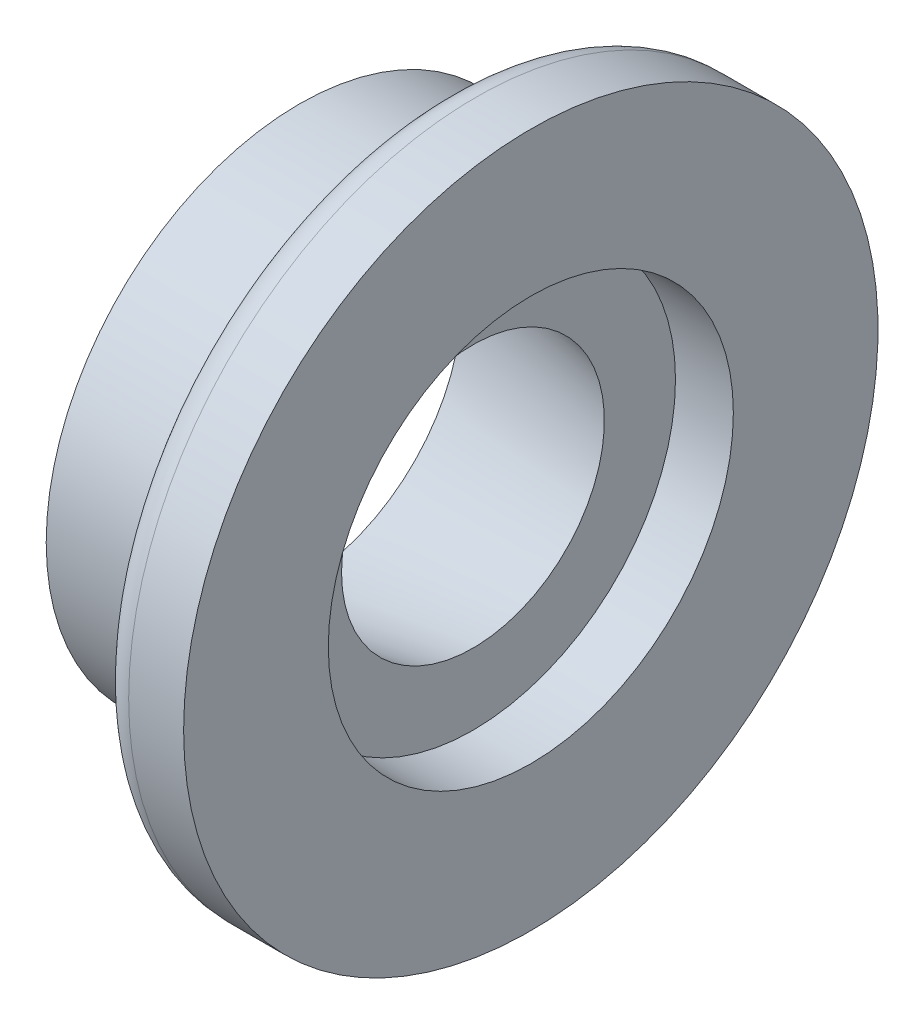
ISO-10303-21;
HEADER;
FILE_DESCRIPTION(('STEP AP214'),'2;1');
FILE_NAME('part.step','',(''),(''),'','','');
FILE_SCHEMA(('AUTOMOTIVE_DESIGN { 1 0 10303 214 1 1 1 1 }'));
ENDSEC;
DATA;
#1=APPLICATION_CONTEXT('core data for automotive mechanical design processes');
#2=APPLICATION_PROTOCOL_DEFINITION('international standard','automotive_design',2000,#1);
#3=PRODUCT_CONTEXT('',#1,'mechanical');
#4=PRODUCT('Part','Part','',(#3));
#5=PRODUCT_RELATED_PRODUCT_CATEGORY('part','',(#4));
#6=PRODUCT_DEFINITION_FORMATION('','',#4);
#7=PRODUCT_DEFINITION_CONTEXT('part definition',#1,'design');
#8=PRODUCT_DEFINITION('design','',#6,#7);
#9=PRODUCT_DEFINITION_SHAPE('','',#8);
#10=(LENGTH_UNIT() NAMED_UNIT(*) SI_UNIT(.MILLI.,.METRE.));
#11=(NAMED_UNIT(*) PLANE_ANGLE_UNIT() SI_UNIT($,.RADIAN.));
#12=(NAMED_UNIT(*) SI_UNIT($,.STERADIAN.) SOLID_ANGLE_UNIT());
#13=UNCERTAINTY_MEASURE_WITH_UNIT(LENGTH_MEASURE(1.E-05),#10,'distance_accuracy_value','');
#14=(GEOMETRIC_REPRESENTATION_CONTEXT(3) GLOBAL_UNCERTAINTY_ASSIGNED_CONTEXT((#13)) GLOBAL_UNIT_ASSIGNED_CONTEXT((#10,
#11,#12)) REPRESENTATION_CONTEXT('',''));
#15=CARTESIAN_POINT('',(0.,0.,0.));
#16=DIRECTION('',(0.,0.,1.));
#17=DIRECTION('',(1.,0.,0.));
#18=AXIS2_PLACEMENT_3D('',#15,#16,#17);
#19=CARTESIAN_POINT('',(39.85,4.54216018214688,0.));
#20=DIRECTION('',(-1.,0.,0.));
#21=DIRECTION('',(0.,0.,1.));
#22=AXIS2_PLACEMENT_3D('',#19,#20,#21);
#23=PLANE('',#22);
#24=CARTESIAN_POINT('',(39.85,0.,0.));
#25=DIRECTION('',(-1.,0.,0.));
#26=DIRECTION('',(0.,0.,1.));
#27=AXIS2_PLACEMENT_3D('',#24,#25,#26);
#28=CIRCLE('',#27,7.);
#29=CARTESIAN_POINT('',(39.85,0.,7.));
#30=VERTEX_POINT('',#29);
#31=EDGE_CURVE('E49',#30,#30,#28,.T.);
#32=ORIENTED_EDGE('',*,*,#31,.F.);
#33=EDGE_LOOP('',(#32));
#34=FACE_BOUND('',#33,.T.);
#35=CARTESIAN_POINT('',(39.85,0.,0.));
#36=DIRECTION('',(-1.,0.,0.));
#37=DIRECTION('',(0.,0.,1.));
#38=AXIS2_PLACEMENT_3D('',#35,#36,#37);
#39=CIRCLE('',#38,4.54216018214688);
#40=CARTESIAN_POINT('',(39.85,0.,4.54216018214688));
#41=VERTEX_POINT('',#40);
#42=EDGE_CURVE('E64',#41,#41,#39,.T.);
#43=ORIENTED_EDGE('',*,*,#42,.T.);
#44=EDGE_LOOP('',(#43));
#45=FACE_BOUND('',#44,.T.);
#46=ADVANCED_FACE('F29',(#34,#45),#23,.F.);
#47=CARTESIAN_POINT('',(0.,0.,0.));
#48=DIRECTION('',(-1.,0.,0.));
#49=DIRECTION('',(0.,0.,1.));
#50=AXIS2_PLACEMENT_3D('',#47,#48,#49);
#51=CYLINDRICAL_SURFACE('',#50,7.);
#52=CARTESIAN_POINT('',(41.85,0.,0.));
#53=DIRECTION('',(-1.,0.,0.));
#54=DIRECTION('',(0.,0.,1.));
#55=AXIS2_PLACEMENT_3D('',#52,#53,#54);
#56=CIRCLE('',#55,7.);
#57=CARTESIAN_POINT('',(41.85,0.,7.));
#58=VERTEX_POINT('',#57);
#59=EDGE_CURVE('E52',#58,#58,#56,.T.);
#60=ORIENTED_EDGE('',*,*,#59,.F.);
#61=EDGE_LOOP('',(#60));
#62=FACE_BOUND('',#61,.T.);
#63=ORIENTED_EDGE('',*,*,#31,.T.);
#64=EDGE_LOOP('',(#63));
#65=FACE_BOUND('',#64,.T.);
#66=ADVANCED_FACE('F93',(#62,#65),#51,.F.);
#67=CARTESIAN_POINT('',(41.85,7.,0.));
#68=DIRECTION('',(-1.,0.,0.));
#69=DIRECTION('',(0.,0.,1.));
#70=AXIS2_PLACEMENT_3D('',#67,#68,#69);
#71=PLANE('',#70);
#72=CARTESIAN_POINT('',(41.85,0.,0.));
#73=DIRECTION('',(-1.,0.,0.));
#74=DIRECTION('',(0.,0.,1.));
#75=AXIS2_PLACEMENT_3D('',#72,#73,#74);
#76=CIRCLE('',#75,12.);
#77=CARTESIAN_POINT('',(41.85,0.,12.));
#78=VERTEX_POINT('',#77);
#79=EDGE_CURVE('E55',#78,#78,#76,.T.);
#80=ORIENTED_EDGE('',*,*,#79,.F.);
#81=EDGE_LOOP('',(#80));
#82=FACE_BOUND('',#81,.T.);
#83=ORIENTED_EDGE('',*,*,#59,.T.);
#84=EDGE_LOOP('',(#83));
#85=FACE_BOUND('',#84,.T.);
#86=ADVANCED_FACE('F99',(#82,#85),#71,.F.);
#87=CARTESIAN_POINT('',(0.,0.,0.));
#88=DIRECTION('',(-1.,0.,0.));
#89=DIRECTION('',(0.,0.,1.));
#90=AXIS2_PLACEMENT_3D('',#87,#88,#89);
#91=CYLINDRICAL_SURFACE('',#90,12.);
#92=CARTESIAN_POINT('',(39.95,0.,0.));
#93=DIRECTION('',(1.,0.,0.));
#94=DIRECTION('',(0.,0.,-1.));
#95=AXIS2_PLACEMENT_3D('',#92,#93,#94);
#96=CIRCLE('',#95,12.);
#97=CARTESIAN_POINT('',(39.95,0.,-12.));
#98=VERTEX_POINT('',#97);
#99=EDGE_CURVE('E36',#98,#98,#96,.T.);
#100=ORIENTED_EDGE('',*,*,#99,.T.);
#101=EDGE_LOOP('',(#100));
#102=FACE_BOUND('',#101,.T.);
#103=ORIENTED_EDGE('',*,*,#79,.T.);
#104=EDGE_LOOP('',(#103));
#105=FACE_BOUND('',#104,.T.);
#106=ADVANCED_FACE('F89',(#102,#105),#91,.T.);
#107=CARTESIAN_POINT('',(38.85,12.,0.));
#108=DIRECTION('',(1.,0.,0.));
#109=DIRECTION('',(0.,0.,-1.));
#110=AXIS2_PLACEMENT_3D('',#107,#108,#109);
#111=PLANE('',#110);
#112=CARTESIAN_POINT('',(38.85,0.,0.));
#113=DIRECTION('',(1.,0.,0.));
#114=DIRECTION('',(0.,0.,-1.));
#115=AXIS2_PLACEMENT_3D('',#112,#113,#114);
#116=CIRCLE('',#115,10.9);
#117=CARTESIAN_POINT('',(38.85,0.,-10.9));
#118=VERTEX_POINT('',#117);
#119=EDGE_CURVE('E40',#118,#118,#116,.F.);
#120=ORIENTED_EDGE('',*,*,#119,.T.);
#121=EDGE_LOOP('',(#120));
#122=FACE_BOUND('',#121,.T.);
#123=CARTESIAN_POINT('',(38.85,0.,0.));
#124=DIRECTION('',(1.,0.,0.));
#125=DIRECTION('',(0.,0.,-1.));
#126=AXIS2_PLACEMENT_3D('',#123,#124,#125);
#127=CIRCLE('',#126,9.84999999999998);
#128=CARTESIAN_POINT('',(38.85,0.,-9.84999999999998));
#129=VERTEX_POINT('',#128);
#130=EDGE_CURVE('E44',#129,#129,#127,.T.);
#131=ORIENTED_EDGE('',*,*,#130,.T.);
#132=EDGE_LOOP('',(#131));
#133=FACE_BOUND('',#132,.T.);
#134=ADVANCED_FACE('F84',(#122,#133),#111,.F.);
#135=CARTESIAN_POINT('',(0.,0.,0.));
#136=DIRECTION('',(-1.,0.,0.));
#137=DIRECTION('',(0.,0.,1.));
#138=AXIS2_PLACEMENT_3D('',#135,#136,#137);
#139=CYLINDRICAL_SURFACE('',#138,8.74999999999998);
#140=CARTESIAN_POINT('',(37.75,0.,0.));
#141=DIRECTION('',(1.,0.,0.));
#142=DIRECTION('',(0.,0.,-1.));
#143=AXIS2_PLACEMENT_3D('',#140,#141,#142);
#144=CIRCLE('',#143,8.74999999999998);
#145=CARTESIAN_POINT('',(37.75,0.,-8.74999999999998));
#146=VERTEX_POINT('',#145);
#147=EDGE_CURVE('E10',#146,#146,#144,.F.);
#148=ORIENTED_EDGE('',*,*,#147,.T.);
#149=EDGE_LOOP('',(#148));
#150=FACE_BOUND('',#149,.T.);
#151=CARTESIAN_POINT('',(33.85,0.,0.));
#152=DIRECTION('',(-1.,0.,0.));
#153=DIRECTION('',(0.,0.,1.));
#154=AXIS2_PLACEMENT_3D('',#151,#152,#153);
#155=CIRCLE('',#154,8.74999999999998);
#156=CARTESIAN_POINT('',(33.85,0.,8.74999999999998));
#157=VERTEX_POINT('',#156);
#158=EDGE_CURVE('E58',#157,#157,#155,.T.);
#159=ORIENTED_EDGE('',*,*,#158,.F.);
#160=EDGE_LOOP('',(#159));
#161=FACE_BOUND('',#160,.T.);
#162=ADVANCED_FACE('F79',(#150,#161),#139,.T.);
#163=CARTESIAN_POINT('',(33.85,8.74999999999998,0.));
#164=DIRECTION('',(1.,0.,0.));
#165=DIRECTION('',(0.,0.,-1.));
#166=AXIS2_PLACEMENT_3D('',#163,#164,#165);
#167=PLANE('',#166);
#168=CARTESIAN_POINT('',(33.85,0.,0.));
#169=DIRECTION('',(-1.,0.,0.));
#170=DIRECTION('',(0.,0.,1.));
#171=AXIS2_PLACEMENT_3D('',#168,#169,#170);
#172=CIRCLE('',#171,5.60012206639769);
#173=CARTESIAN_POINT('',(33.85,0.,5.60012206639769));
#174=VERTEX_POINT('',#173);
#175=EDGE_CURVE('E61',#174,#174,#172,.T.);
#176=ORIENTED_EDGE('',*,*,#175,.F.);
#177=EDGE_LOOP('',(#176));
#178=FACE_BOUND('',#177,.T.);
#179=ORIENTED_EDGE('',*,*,#158,.T.);
#180=EDGE_LOOP('',(#179));
#181=FACE_BOUND('',#180,.T.);
#182=ADVANCED_FACE('F73',(#178,#181),#167,.F.);
#183=CARTESIAN_POINT('',(33.85,0.,0.));
#184=DIRECTION('',(-1.,0.,0.));
#185=DIRECTION('',(0.,0.,1.));
#186=AXIS2_PLACEMENT_3D('',#183,#184,#185);
#187=CONICAL_SURFACE('',#186,5.60012206639769,0.174532925199437);
#188=ORIENTED_EDGE('',*,*,#42,.F.);
#189=EDGE_LOOP('',(#188));
#190=FACE_BOUND('',#189,.T.);
#191=ORIENTED_EDGE('',*,*,#175,.T.);
#192=EDGE_LOOP('',(#191));
#193=FACE_BOUND('',#192,.T.);
#194=ADVANCED_FACE('F69',(#190,#193),#187,.F.);
#195=CARTESIAN_POINT('',(39.95,0.,0.));
#196=DIRECTION('',(1.,0.,0.));
#197=DIRECTION('',(0.,0.,-1.));
#198=AXIS2_PLACEMENT_3D('',#195,#196,#197);
#199=TOROIDAL_SURFACE('',#198,10.9,1.1);
#200=ORIENTED_EDGE('',*,*,#99,.F.);
#201=EDGE_LOOP('',(#200));
#202=FACE_BOUND('',#201,.T.);
#203=ORIENTED_EDGE('',*,*,#119,.F.);
#204=EDGE_LOOP('',(#203));
#205=FACE_BOUND('',#204,.T.);
#206=ADVANCED_FACE('F72',(#202,#205),#199,.T.);
#207=CARTESIAN_POINT('',(37.75,0.,0.));
#208=DIRECTION('',(1.,0.,0.));
#209=DIRECTION('',(0.,0.,-1.));
#210=AXIS2_PLACEMENT_3D('',#207,#208,#209);
#211=TOROIDAL_SURFACE('',#210,9.84999999999998,1.1);
#212=ORIENTED_EDGE('',*,*,#130,.F.);
#213=EDGE_LOOP('',(#212));
#214=FACE_BOUND('',#213,.T.);
#215=ORIENTED_EDGE('',*,*,#147,.F.);
#216=EDGE_LOOP('',(#215));
#217=FACE_BOUND('',#216,.T.);
#218=ADVANCED_FACE('F31',(#214,#217),#211,.F.);
#219=CLOSED_SHELL('',(#46,#66,#86,#106,#134,#162,#182,#194,#206,#218));
#220=MANIFOLD_SOLID_BREP('B2',#219);
#221=ADVANCED_BREP_SHAPE_REPRESENTATION('',(#18,#220),#14);
#222=SHAPE_DEFINITION_REPRESENTATION(#9,#221);
ENDSEC;
END-ISO-10303-21;
